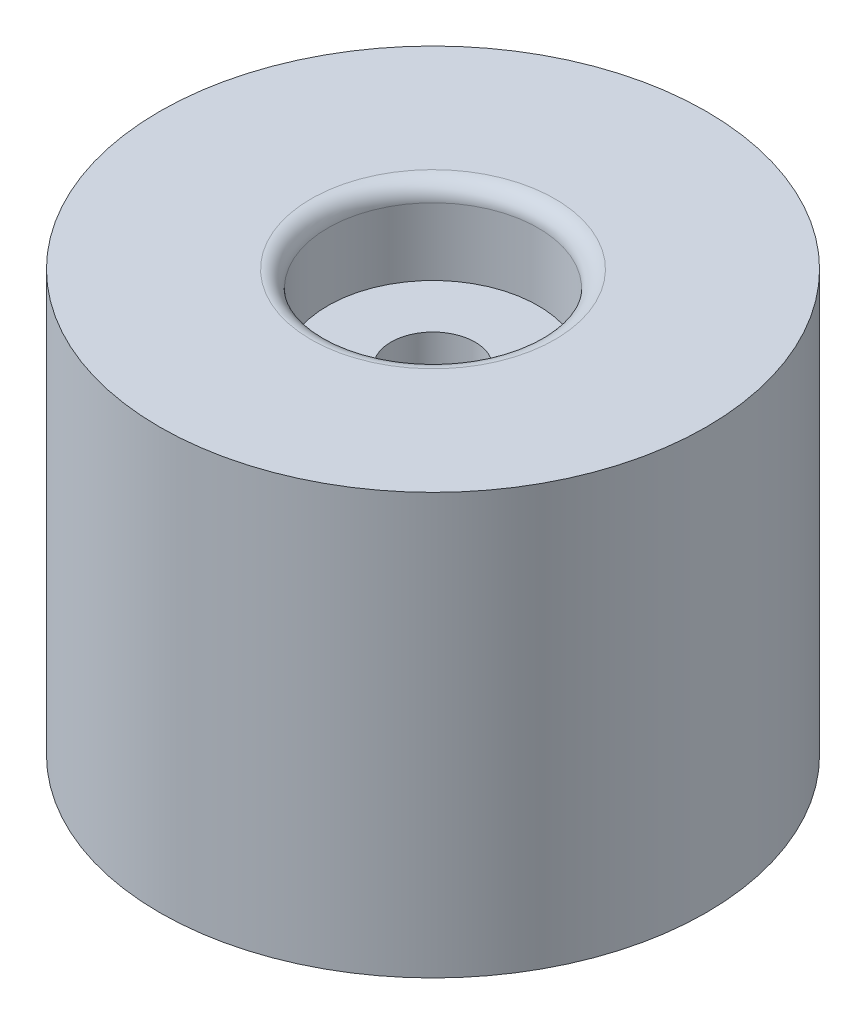
ISO-10303-21;
HEADER;
FILE_DESCRIPTION(('STEP AP214'),'2;1');
FILE_NAME('part.step','',(''),(''),'','','');
FILE_SCHEMA(('AUTOMOTIVE_DESIGN { 1 0 10303 214 1 1 1 1 }'));
ENDSEC;
DATA;
#1=APPLICATION_CONTEXT('core data for automotive mechanical design processes');
#2=APPLICATION_PROTOCOL_DEFINITION('international standard','automotive_design',2000,#1);
#3=PRODUCT_CONTEXT('',#1,'mechanical');
#4=PRODUCT('Part','Part','',(#3));
#5=PRODUCT_RELATED_PRODUCT_CATEGORY('part','',(#4));
#6=PRODUCT_DEFINITION_FORMATION('','',#4);
#7=PRODUCT_DEFINITION_CONTEXT('part definition',#1,'design');
#8=PRODUCT_DEFINITION('design','',#6,#7);
#9=PRODUCT_DEFINITION_SHAPE('','',#8);
#10=(LENGTH_UNIT() NAMED_UNIT(*) SI_UNIT(.MILLI.,.METRE.));
#11=(NAMED_UNIT(*) PLANE_ANGLE_UNIT() SI_UNIT($,.RADIAN.));
#12=(NAMED_UNIT(*) SI_UNIT($,.STERADIAN.) SOLID_ANGLE_UNIT());
#13=UNCERTAINTY_MEASURE_WITH_UNIT(LENGTH_MEASURE(1.E-05),#10,'distance_accuracy_value','');
#14=(GEOMETRIC_REPRESENTATION_CONTEXT(3) GLOBAL_UNCERTAINTY_ASSIGNED_CONTEXT((#13)) GLOBAL_UNIT_ASSIGNED_CONTEXT((#10,
#11,#12)) REPRESENTATION_CONTEXT('',''));
#15=CARTESIAN_POINT('',(0.,0.,0.));
#16=DIRECTION('',(0.,0.,1.));
#17=DIRECTION('',(1.,0.,0.));
#18=AXIS2_PLACEMENT_3D('',#15,#16,#17);
#19=CARTESIAN_POINT('',(0.,10.,0.));
#20=DIRECTION('',(0.,-1.,0.));
#21=DIRECTION('',(0.,0.,-1.));
#22=AXIS2_PLACEMENT_3D('',#19,#20,#21);
#23=CYLINDRICAL_SURFACE('',#22,1.);
#24=CARTESIAN_POINT('',(0.,6.,0.));
#25=DIRECTION('',(0.,1.,0.));
#26=DIRECTION('',(0.,0.,1.));
#27=AXIS2_PLACEMENT_3D('',#24,#25,#26);
#28=CIRCLE('',#27,1.);
#29=CARTESIAN_POINT('',(0.,6.,1.));
#30=VERTEX_POINT('',#29);
#31=EDGE_CURVE('E146',#30,#30,#28,.T.);
#32=ORIENTED_EDGE('',*,*,#31,.F.);
#33=EDGE_LOOP('',(#32));
#34=FACE_BOUND('',#33,.T.);
#35=CARTESIAN_POINT('',(0.,8.,0.));
#36=DIRECTION('',(0.,1.,0.));
#37=DIRECTION('',(0.,0.,1.));
#38=AXIS2_PLACEMENT_3D('',#35,#36,#37);
#39=CIRCLE('',#38,1.);
#40=CARTESIAN_POINT('',(0.,8.,1.));
#41=VERTEX_POINT('',#40);
#42=EDGE_CURVE('E143',#41,#41,#39,.T.);
#43=ORIENTED_EDGE('',*,*,#42,.T.);
#44=EDGE_LOOP('',(#43));
#45=FACE_BOUND('',#44,.T.);
#46=ADVANCED_FACE('F41',(#34,#45),#23,.F.);
#47=CARTESIAN_POINT('',(0.,0.,0.));
#48=DIRECTION('',(0.,1.,0.));
#49=DIRECTION('',(0.,0.,1.));
#50=AXIS2_PLACEMENT_3D('',#47,#48,#49);
#51=PLANE('',#50);
#52=CARTESIAN_POINT('',(0.,0.,0.));
#53=DIRECTION('',(0.,1.,0.));
#54=DIRECTION('',(0.,0.,1.));
#55=AXIS2_PLACEMENT_3D('',#52,#53,#54);
#56=CIRCLE('',#55,6.5);
#57=CARTESIAN_POINT('',(0.,0.,6.5));
#58=VERTEX_POINT('',#57);
#59=EDGE_CURVE('E139',#58,#58,#56,.T.);
#60=ORIENTED_EDGE('',*,*,#59,.F.);
#61=EDGE_LOOP('',(#60));
#62=FACE_BOUND('',#61,.T.);
#63=DIRECTION('',(0.866025403784439,0.,-0.5));
#64=VECTOR('',#63,1.);
#65=CARTESIAN_POINT('',(0.,0.,5.83123771881522));
#66=LINE('',#65,#64);
#67=CARTESIAN_POINT('',(0.,0.,5.83123771881522));
#68=VERTEX_POINT('',#67);
#69=CARTESIAN_POINT('',(5.05,0.,2.91561885940761));
#70=VERTEX_POINT('',#69);
#71=EDGE_CURVE('E57',#68,#70,#66,.T.);
#72=ORIENTED_EDGE('',*,*,#71,.T.);
#73=DIRECTION('',(0.,0.,-1.));
#74=VECTOR('',#73,1.);
#75=CARTESIAN_POINT('',(5.05,0.,2.91561885940761));
#76=LINE('',#75,#74);
#77=CARTESIAN_POINT('',(5.05,0.,-2.91561885940761));
#78=VERTEX_POINT('',#77);
#79=EDGE_CURVE('E118',#70,#78,#76,.T.);
#80=ORIENTED_EDGE('',*,*,#79,.T.);
#81=DIRECTION('',(-0.866025403784439,0.,-0.5));
#82=VECTOR('',#81,1.);
#83=CARTESIAN_POINT('',(5.05,0.,-2.91561885940761));
#84=LINE('',#83,#82);
#85=CARTESIAN_POINT('',(0.,0.,-5.83123771881522));
#86=VERTEX_POINT('',#85);
#87=EDGE_CURVE('E114',#78,#86,#84,.T.);
#88=ORIENTED_EDGE('',*,*,#87,.T.);
#89=DIRECTION('',(-0.866025403784439,0.,0.5));
#90=VECTOR('',#89,1.);
#91=CARTESIAN_POINT('',(0.,0.,-5.83123771881522));
#92=LINE('',#91,#90);
#93=CARTESIAN_POINT('',(-5.05,0.,-2.91561885940761));
#94=VERTEX_POINT('',#93);
#95=EDGE_CURVE('E92',#86,#94,#92,.T.);
#96=ORIENTED_EDGE('',*,*,#95,.T.);
#97=DIRECTION('',(0.,0.,1.));
#98=VECTOR('',#97,1.);
#99=CARTESIAN_POINT('',(-5.05,0.,-2.91561885940761));
#100=LINE('',#99,#98);
#101=CARTESIAN_POINT('',(-5.05,0.,2.91561885940761));
#102=VERTEX_POINT('',#101);
#103=EDGE_CURVE('E102',#94,#102,#100,.T.);
#104=ORIENTED_EDGE('',*,*,#103,.T.);
#105=DIRECTION('',(0.866025403784439,0.,0.5));
#106=VECTOR('',#105,1.);
#107=CARTESIAN_POINT('',(-5.05,0.,2.91561885940761));
#108=LINE('',#107,#106);
#109=EDGE_CURVE('E109',#102,#68,#108,.T.);
#110=ORIENTED_EDGE('',*,*,#109,.T.);
#111=EDGE_LOOP('',(#72,#80,#88,#96,#104,#110));
#112=FACE_BOUND('',#111,.T.);
#113=ADVANCED_FACE('F111',(#62,#112),#51,.F.);
#114=CARTESIAN_POINT('',(0.,6.,0.));
#115=DIRECTION('',(0.,-1.,0.));
#116=DIRECTION('',(0.,0.,-1.));
#117=AXIS2_PLACEMENT_3D('',#114,#115,#116);
#118=CYLINDRICAL_SURFACE('',#117,6.5);
#119=ORIENTED_EDGE('',*,*,#59,.T.);
#120=EDGE_LOOP('',(#119));
#121=FACE_BOUND('',#120,.T.);
#122=CARTESIAN_POINT('',(0.,10.,0.));
#123=DIRECTION('',(0.,1.,0.));
#124=DIRECTION('',(0.,0.,1.));
#125=AXIS2_PLACEMENT_3D('',#122,#123,#124);
#126=CIRCLE('',#125,6.5);
#127=CARTESIAN_POINT('',(0.,10.,6.5));
#128=VERTEX_POINT('',#127);
#129=EDGE_CURVE('E210',#128,#128,#126,.T.);
#130=ORIENTED_EDGE('',*,*,#129,.F.);
#131=EDGE_LOOP('',(#130));
#132=FACE_BOUND('',#131,.T.);
#133=ADVANCED_FACE('F170',(#121,#132),#118,.T.);
#134=CARTESIAN_POINT('',(0.,6.,5.83123771881522));
#135=DIRECTION('',(-0.5,0.,-0.866025403784439));
#136=DIRECTION('',(-0.866025403784439,0.,0.5));
#137=AXIS2_PLACEMENT_3D('',#134,#135,#136);
#138=PLANE('',#137);
#139=ORIENTED_EDGE('',*,*,#71,.F.);
#140=DIRECTION('',(0.,-1.,0.));
#141=VECTOR('',#140,1.);
#142=CARTESIAN_POINT('',(0.,6.,5.83123771881522));
#143=LINE('',#142,#141);
#144=CARTESIAN_POINT('',(0.,6.,5.83123771881522));
#145=VERTEX_POINT('',#144);
#146=EDGE_CURVE('E125',#145,#68,#143,.T.);
#147=ORIENTED_EDGE('',*,*,#146,.F.);
#148=DIRECTION('',(0.866025403784439,0.,-0.5));
#149=VECTOR('',#148,1.);
#150=CARTESIAN_POINT('',(0.,6.,5.83123771881522));
#151=LINE('',#150,#149);
#152=CARTESIAN_POINT('',(5.05,6.,2.91561885940761));
#153=VERTEX_POINT('',#152);
#154=EDGE_CURVE('E124',#145,#153,#151,.T.);
#155=ORIENTED_EDGE('',*,*,#154,.T.);
#156=DIRECTION('',(0.,-1.,0.));
#157=VECTOR('',#156,1.);
#158=CARTESIAN_POINT('',(5.05,6.,2.91561885940761));
#159=LINE('',#158,#157);
#160=EDGE_CURVE('E136',#153,#70,#159,.T.);
#161=ORIENTED_EDGE('',*,*,#160,.T.);
#162=EDGE_LOOP('',(#139,#147,#155,#161));
#163=FACE_BOUND('',#162,.T.);
#164=ADVANCED_FACE('F199',(#163),#138,.T.);
#165=CARTESIAN_POINT('',(5.05,6.,2.91561885940761));
#166=DIRECTION('',(-1.,0.,0.));
#167=DIRECTION('',(0.,0.,1.));
#168=AXIS2_PLACEMENT_3D('',#165,#166,#167);
#169=PLANE('',#168);
#170=ORIENTED_EDGE('',*,*,#79,.F.);
#171=ORIENTED_EDGE('',*,*,#160,.F.);
#172=DIRECTION('',(0.,0.,-1.));
#173=VECTOR('',#172,1.);
#174=CARTESIAN_POINT('',(5.05,6.,2.91561885940761));
#175=LINE('',#174,#173);
#176=CARTESIAN_POINT('',(5.05,6.,-2.91561885940761));
#177=VERTEX_POINT('',#176);
#178=EDGE_CURVE('E224',#153,#177,#175,.T.);
#179=ORIENTED_EDGE('',*,*,#178,.T.);
#180=DIRECTION('',(0.,-1.,0.));
#181=VECTOR('',#180,1.);
#182=CARTESIAN_POINT('',(5.05,6.,-2.91561885940761));
#183=LINE('',#182,#181);
#184=EDGE_CURVE('E133',#177,#78,#183,.T.);
#185=ORIENTED_EDGE('',*,*,#184,.T.);
#186=EDGE_LOOP('',(#170,#171,#179,#185));
#187=FACE_BOUND('',#186,.T.);
#188=ADVANCED_FACE('F195',(#187),#169,.T.);
#189=CARTESIAN_POINT('',(5.05,6.,-2.91561885940761));
#190=DIRECTION('',(-0.5,0.,0.866025403784439));
#191=DIRECTION('',(0.866025403784439,0.,0.5));
#192=AXIS2_PLACEMENT_3D('',#189,#190,#191);
#193=PLANE('',#192);
#194=ORIENTED_EDGE('',*,*,#87,.F.);
#195=ORIENTED_EDGE('',*,*,#184,.F.);
#196=DIRECTION('',(-0.866025403784439,0.,-0.5));
#197=VECTOR('',#196,1.);
#198=CARTESIAN_POINT('',(5.05,6.,-2.91561885940761));
#199=LINE('',#198,#197);
#200=CARTESIAN_POINT('',(0.,6.,-5.83123771881522));
#201=VERTEX_POINT('',#200);
#202=EDGE_CURVE('E228',#177,#201,#199,.T.);
#203=ORIENTED_EDGE('',*,*,#202,.T.);
#204=DIRECTION('',(0.,-1.,0.));
#205=VECTOR('',#204,1.);
#206=CARTESIAN_POINT('',(0.,6.,-5.83123771881522));
#207=LINE('',#206,#205);
#208=EDGE_CURVE('E98',#201,#86,#207,.T.);
#209=ORIENTED_EDGE('',*,*,#208,.T.);
#210=EDGE_LOOP('',(#194,#195,#203,#209));
#211=FACE_BOUND('',#210,.T.);
#212=ADVANCED_FACE('F192',(#211),#193,.T.);
#213=CARTESIAN_POINT('',(0.,6.,-5.83123771881522));
#214=DIRECTION('',(0.5,0.,0.866025403784439));
#215=DIRECTION('',(0.866025403784439,0.,-0.5));
#216=AXIS2_PLACEMENT_3D('',#213,#214,#215);
#217=PLANE('',#216);
#218=ORIENTED_EDGE('',*,*,#95,.F.);
#219=ORIENTED_EDGE('',*,*,#208,.F.);
#220=DIRECTION('',(-0.866025403784439,0.,0.5));
#221=VECTOR('',#220,1.);
#222=CARTESIAN_POINT('',(0.,6.,-5.83123771881522));
#223=LINE('',#222,#221);
#224=CARTESIAN_POINT('',(-5.05,6.,-2.91561885940761));
#225=VERTEX_POINT('',#224);
#226=EDGE_CURVE('E66',#201,#225,#223,.T.);
#227=ORIENTED_EDGE('',*,*,#226,.T.);
#228=DIRECTION('',(0.,-1.,0.));
#229=VECTOR('',#228,1.);
#230=CARTESIAN_POINT('',(-5.05,6.,-2.91561885940761));
#231=LINE('',#230,#229);
#232=EDGE_CURVE('E87',#225,#94,#231,.T.);
#233=ORIENTED_EDGE('',*,*,#232,.T.);
#234=EDGE_LOOP('',(#218,#219,#227,#233));
#235=FACE_BOUND('',#234,.T.);
#236=ADVANCED_FACE('F89',(#235),#217,.T.);
#237=CARTESIAN_POINT('',(-5.05,6.,-2.91561885940761));
#238=DIRECTION('',(1.,0.,0.));
#239=DIRECTION('',(0.,0.,-1.));
#240=AXIS2_PLACEMENT_3D('',#237,#238,#239);
#241=PLANE('',#240);
#242=ORIENTED_EDGE('',*,*,#103,.F.);
#243=ORIENTED_EDGE('',*,*,#232,.F.);
#244=DIRECTION('',(0.,0.,1.));
#245=VECTOR('',#244,1.);
#246=CARTESIAN_POINT('',(-5.05,6.,-2.91561885940761));
#247=LINE('',#246,#245);
#248=CARTESIAN_POINT('',(-5.05,6.,2.91561885940761));
#249=VERTEX_POINT('',#248);
#250=EDGE_CURVE('E233',#225,#249,#247,.T.);
#251=ORIENTED_EDGE('',*,*,#250,.T.);
#252=DIRECTION('',(0.,-1.,0.));
#253=VECTOR('',#252,1.);
#254=CARTESIAN_POINT('',(-5.05,6.,2.91561885940761));
#255=LINE('',#254,#253);
#256=EDGE_CURVE('E99',#249,#102,#255,.T.);
#257=ORIENTED_EDGE('',*,*,#256,.T.);
#258=EDGE_LOOP('',(#242,#243,#251,#257));
#259=FACE_BOUND('',#258,.T.);
#260=ADVANCED_FACE('F103',(#259),#241,.T.);
#261=CARTESIAN_POINT('',(-5.05,6.,2.91561885940761));
#262=DIRECTION('',(0.5,0.,-0.866025403784438));
#263=DIRECTION('',(-0.866025403784439,0.,-0.5));
#264=AXIS2_PLACEMENT_3D('',#261,#262,#263);
#265=PLANE('',#264);
#266=ORIENTED_EDGE('',*,*,#109,.F.);
#267=ORIENTED_EDGE('',*,*,#256,.F.);
#268=DIRECTION('',(0.866025403784439,0.,0.5));
#269=VECTOR('',#268,1.);
#270=CARTESIAN_POINT('',(-5.05,6.,2.91561885940761));
#271=LINE('',#270,#269);
#272=EDGE_CURVE('E128',#249,#145,#271,.T.);
#273=ORIENTED_EDGE('',*,*,#272,.T.);
#274=ORIENTED_EDGE('',*,*,#146,.T.);
#275=EDGE_LOOP('',(#266,#267,#273,#274));
#276=FACE_BOUND('',#275,.T.);
#277=ADVANCED_FACE('F181',(#276),#265,.T.);
#278=CARTESIAN_POINT('',(0.,10.,0.));
#279=DIRECTION('',(0.,1.,0.));
#280=DIRECTION('',(0.,0.,1.));
#281=AXIS2_PLACEMENT_3D('',#278,#279,#280);
#282=PLANE('',#281);
#283=CARTESIAN_POINT('',(0.,10.,0.));
#284=DIRECTION('',(0.,1.,0.));
#285=DIRECTION('',(0.,0.,1.));
#286=AXIS2_PLACEMENT_3D('',#283,#284,#285);
#287=CIRCLE('',#286,2.9);
#288=CARTESIAN_POINT('',(0.,10.,2.9));
#289=VERTEX_POINT('',#288);
#290=EDGE_CURVE('E11',#289,#289,#287,.F.);
#291=ORIENTED_EDGE('',*,*,#290,.T.);
#292=EDGE_LOOP('',(#291));
#293=FACE_BOUND('',#292,.T.);
#294=ORIENTED_EDGE('',*,*,#129,.T.);
#295=EDGE_LOOP('',(#294));
#296=FACE_BOUND('',#295,.T.);
#297=ADVANCED_FACE('F177',(#293,#296),#282,.T.);
#298=CARTESIAN_POINT('',(0.,6.,0.));
#299=DIRECTION('',(0.,1.,0.));
#300=DIRECTION('',(0.,0.,1.));
#301=AXIS2_PLACEMENT_3D('',#298,#299,#300);
#302=PLANE('',#301);
#303=ORIENTED_EDGE('',*,*,#178,.F.);
#304=ORIENTED_EDGE('',*,*,#154,.F.);
#305=ORIENTED_EDGE('',*,*,#272,.F.);
#306=ORIENTED_EDGE('',*,*,#250,.F.);
#307=ORIENTED_EDGE('',*,*,#226,.F.);
#308=ORIENTED_EDGE('',*,*,#202,.F.);
#309=EDGE_LOOP('',(#303,#304,#305,#306,#307,#308));
#310=FACE_BOUND('',#309,.T.);
#311=ORIENTED_EDGE('',*,*,#31,.T.);
#312=EDGE_LOOP('',(#311));
#313=FACE_BOUND('',#312,.T.);
#314=ADVANCED_FACE('F180',(#310,#313),#302,.F.);
#315=CARTESIAN_POINT('',(0.,8.,0.));
#316=DIRECTION('',(0.,1.,0.));
#317=DIRECTION('',(0.,0.,1.));
#318=AXIS2_PLACEMENT_3D('',#315,#316,#317);
#319=CYLINDRICAL_SURFACE('',#318,2.5);
#320=CARTESIAN_POINT('',(0.,9.6,0.));
#321=DIRECTION('',(0.,1.,0.));
#322=DIRECTION('',(0.,0.,1.));
#323=AXIS2_PLACEMENT_3D('',#320,#321,#322);
#324=CIRCLE('',#323,2.5);
#325=CARTESIAN_POINT('',(0.,9.6,2.5));
#326=VERTEX_POINT('',#325);
#327=EDGE_CURVE('E50',#326,#326,#324,.T.);
#328=ORIENTED_EDGE('',*,*,#327,.T.);
#329=EDGE_LOOP('',(#328));
#330=FACE_BOUND('',#329,.T.);
#331=CARTESIAN_POINT('',(0.,8.,0.));
#332=DIRECTION('',(0.,1.,0.));
#333=DIRECTION('',(0.,0.,1.));
#334=AXIS2_PLACEMENT_3D('',#331,#332,#333);
#335=CIRCLE('',#334,2.5);
#336=CARTESIAN_POINT('',(0.,8.,2.5));
#337=VERTEX_POINT('',#336);
#338=EDGE_CURVE('E147',#337,#337,#335,.T.);
#339=ORIENTED_EDGE('',*,*,#338,.F.);
#340=EDGE_LOOP('',(#339));
#341=FACE_BOUND('',#340,.T.);
#342=ADVANCED_FACE('F152',(#330,#341),#319,.F.);
#343=CARTESIAN_POINT('',(0.,8.,0.));
#344=DIRECTION('',(0.,1.,0.));
#345=DIRECTION('',(0.,0.,1.));
#346=AXIS2_PLACEMENT_3D('',#343,#344,#345);
#347=PLANE('',#346);
#348=ORIENTED_EDGE('',*,*,#42,.F.);
#349=EDGE_LOOP('',(#348));
#350=FACE_BOUND('',#349,.T.);
#351=ORIENTED_EDGE('',*,*,#338,.T.);
#352=EDGE_LOOP('',(#351));
#353=FACE_BOUND('',#352,.T.);
#354=ADVANCED_FACE('F156',(#350,#353),#347,.T.);
#355=CARTESIAN_POINT('',(0.,9.6,0.));
#356=DIRECTION('',(0.,1.,0.));
#357=DIRECTION('',(0.,0.,1.));
#358=AXIS2_PLACEMENT_3D('',#355,#356,#357);
#359=TOROIDAL_SURFACE('',#358,2.9,0.4);
#360=ORIENTED_EDGE('',*,*,#290,.F.);
#361=EDGE_LOOP('',(#360));
#362=FACE_BOUND('',#361,.T.);
#363=ORIENTED_EDGE('',*,*,#327,.F.);
#364=EDGE_LOOP('',(#363));
#365=FACE_BOUND('',#364,.T.);
#366=ADVANCED_FACE('F43',(#362,#365),#359,.T.);
#367=CLOSED_SHELL('',(#46,#113,#133,#164,#188,#212,#236,#260,#277,#297,#314,#342,#354,#366));
#368=MANIFOLD_SOLID_BREP('B2',#367);
#369=ADVANCED_BREP_SHAPE_REPRESENTATION('',(#18,#368),#14);
#370=SHAPE_DEFINITION_REPRESENTATION(#9,#369);
ENDSEC;
END-ISO-10303-21;
